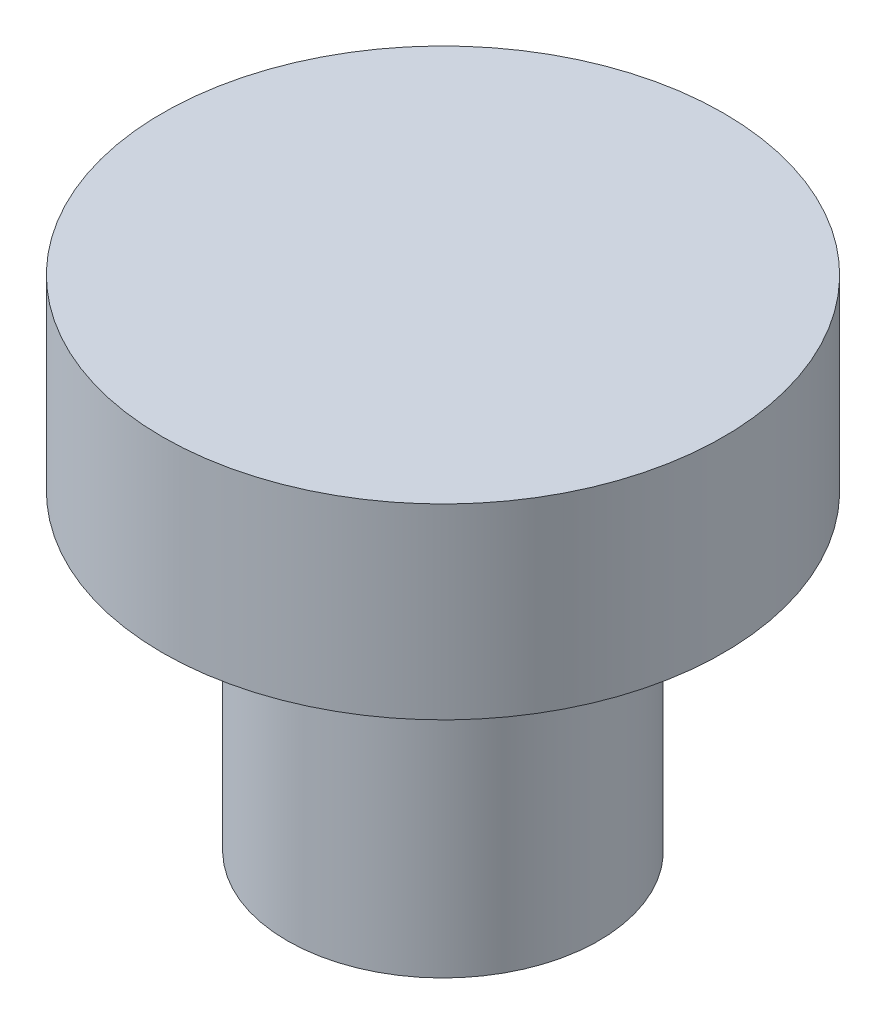
ISO-10303-21;
HEADER;
FILE_DESCRIPTION(('STEP AP214'),'2;1');
FILE_NAME('part.step','',(''),(''),'','','');
FILE_SCHEMA(('AUTOMOTIVE_DESIGN { 1 0 10303 214 1 1 1 1 }'));
ENDSEC;
DATA;
#1=APPLICATION_CONTEXT('core data for automotive mechanical design processes');
#2=APPLICATION_PROTOCOL_DEFINITION('international standard','automotive_design',2000,#1);
#3=PRODUCT_CONTEXT('',#1,'mechanical');
#4=PRODUCT('Part','Part','',(#3));
#5=PRODUCT_RELATED_PRODUCT_CATEGORY('part','',(#4));
#6=PRODUCT_DEFINITION_FORMATION('','',#4);
#7=PRODUCT_DEFINITION_CONTEXT('part definition',#1,'design');
#8=PRODUCT_DEFINITION('design','',#6,#7);
#9=PRODUCT_DEFINITION_SHAPE('','',#8);
#10=(LENGTH_UNIT() NAMED_UNIT(*) SI_UNIT(.MILLI.,.METRE.));
#11=(NAMED_UNIT(*) PLANE_ANGLE_UNIT() SI_UNIT($,.RADIAN.));
#12=(NAMED_UNIT(*) SI_UNIT($,.STERADIAN.) SOLID_ANGLE_UNIT());
#13=UNCERTAINTY_MEASURE_WITH_UNIT(LENGTH_MEASURE(1.E-05),#10,'distance_accuracy_value','');
#14=(GEOMETRIC_REPRESENTATION_CONTEXT(3) GLOBAL_UNCERTAINTY_ASSIGNED_CONTEXT((#13)) GLOBAL_UNIT_ASSIGNED_CONTEXT((#10,
#11,#12)) REPRESENTATION_CONTEXT('',''));
#15=CARTESIAN_POINT('',(0.,0.,0.));
#16=DIRECTION('',(0.,0.,1.));
#17=DIRECTION('',(1.,0.,0.));
#18=AXIS2_PLACEMENT_3D('',#15,#16,#17);
#19=CARTESIAN_POINT('',(0.,3.,0.));
#20=DIRECTION('',(0.,-1.,0.));
#21=DIRECTION('',(0.,0.,-1.));
#22=AXIS2_PLACEMENT_3D('',#19,#20,#21);
#23=CYLINDRICAL_SURFACE('',#22,4.5);
#24=CARTESIAN_POINT('',(0.,3.,0.));
#25=DIRECTION('',(0.,1.,0.));
#26=DIRECTION('',(0.,0.,1.));
#27=AXIS2_PLACEMENT_3D('',#24,#25,#26);
#28=CIRCLE('',#27,4.5);
#29=CARTESIAN_POINT('',(0.,3.,4.5));
#30=VERTEX_POINT('',#29);
#31=EDGE_CURVE('E10',#30,#30,#28,.T.);
#32=ORIENTED_EDGE('',*,*,#31,.F.);
#33=EDGE_LOOP('',(#32));
#34=FACE_BOUND('',#33,.T.);
#35=CARTESIAN_POINT('',(0.,0.,0.));
#36=DIRECTION('',(0.,1.,0.));
#37=DIRECTION('',(0.,0.,1.));
#38=AXIS2_PLACEMENT_3D('',#35,#36,#37);
#39=CIRCLE('',#38,4.5);
#40=CARTESIAN_POINT('',(0.,0.,4.5));
#41=VERTEX_POINT('',#40);
#42=EDGE_CURVE('E42',#41,#41,#39,.T.);
#43=ORIENTED_EDGE('',*,*,#42,.T.);
#44=EDGE_LOOP('',(#43));
#45=FACE_BOUND('',#44,.T.);
#46=ADVANCED_FACE('F41',(#34,#45),#23,.T.);
#47=CARTESIAN_POINT('',(0.,3.,0.));
#48=DIRECTION('',(0.,1.,0.));
#49=DIRECTION('',(0.,0.,1.));
#50=AXIS2_PLACEMENT_3D('',#47,#48,#49);
#51=PLANE('',#50);
#52=ORIENTED_EDGE('',*,*,#31,.T.);
#53=EDGE_LOOP('',(#52));
#54=FACE_BOUND('',#53,.T.);
#55=ADVANCED_FACE('F74',(#54),#51,.T.);
#56=CARTESIAN_POINT('',(0.,0.,0.));
#57=DIRECTION('',(0.,1.,0.));
#58=DIRECTION('',(0.,0.,1.));
#59=AXIS2_PLACEMENT_3D('',#56,#57,#58);
#60=PLANE('',#59);
#61=CARTESIAN_POINT('',(0.,0.,0.));
#62=DIRECTION('',(0.,1.,0.));
#63=DIRECTION('',(0.,0.,1.));
#64=AXIS2_PLACEMENT_3D('',#61,#62,#63);
#65=CIRCLE('',#64,2.5);
#66=CARTESIAN_POINT('',(0.,0.,2.5));
#67=VERTEX_POINT('',#66);
#68=EDGE_CURVE('E51',#67,#67,#65,.T.);
#69=ORIENTED_EDGE('',*,*,#68,.T.);
#70=EDGE_LOOP('',(#69));
#71=FACE_BOUND('',#70,.T.);
#72=ORIENTED_EDGE('',*,*,#42,.F.);
#73=EDGE_LOOP('',(#72));
#74=FACE_BOUND('',#73,.T.);
#75=ADVANCED_FACE('F56',(#71,#74),#60,.F.);
#76=CARTESIAN_POINT('',(0.,0.,0.));
#77=DIRECTION('',(0.,-1.,0.));
#78=DIRECTION('',(0.,0.,-1.));
#79=AXIS2_PLACEMENT_3D('',#76,#77,#78);
#80=CYLINDRICAL_SURFACE('',#79,2.5);
#81=ORIENTED_EDGE('',*,*,#68,.F.);
#82=EDGE_LOOP('',(#81));
#83=FACE_BOUND('',#82,.T.);
#84=CARTESIAN_POINT('',(0.,-5.,0.));
#85=DIRECTION('',(0.,1.,0.));
#86=DIRECTION('',(0.,0.,1.));
#87=AXIS2_PLACEMENT_3D('',#84,#85,#86);
#88=CIRCLE('',#87,2.5);
#89=CARTESIAN_POINT('',(0.,-5.,2.5));
#90=VERTEX_POINT('',#89);
#91=EDGE_CURVE('E52',#90,#90,#88,.T.);
#92=ORIENTED_EDGE('',*,*,#91,.T.);
#93=EDGE_LOOP('',(#92));
#94=FACE_BOUND('',#93,.T.);
#95=ADVANCED_FACE('F61',(#83,#94),#80,.T.);
#96=CARTESIAN_POINT('',(0.,-5.,0.));
#97=DIRECTION('',(0.,1.,0.));
#98=DIRECTION('',(0.,0.,1.));
#99=AXIS2_PLACEMENT_3D('',#96,#97,#98);
#100=PLANE('',#99);
#101=ORIENTED_EDGE('',*,*,#91,.F.);
#102=EDGE_LOOP('',(#101));
#103=FACE_BOUND('',#102,.T.);
#104=ADVANCED_FACE('F62',(#103),#100,.F.);
#105=CLOSED_SHELL('',(#46,#55,#75,#95,#104));
#106=MANIFOLD_SOLID_BREP('B2',#105);
#107=ADVANCED_BREP_SHAPE_REPRESENTATION('',(#18,#106),#14);
#108=SHAPE_DEFINITION_REPRESENTATION(#9,#107);
ENDSEC;
END-ISO-10303-21;
